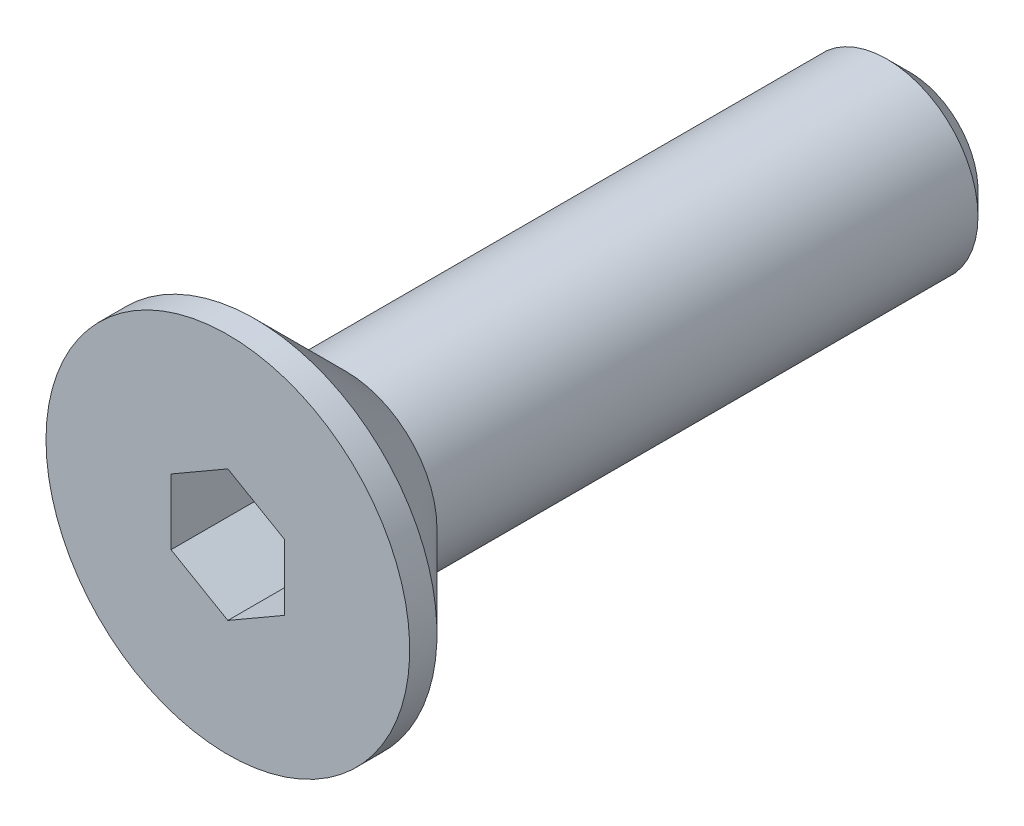
ISO-10303-21;
HEADER;
FILE_DESCRIPTION(('STEP AP214'),'2;1');
FILE_NAME('part.step','',(''),(''),'','','');
FILE_SCHEMA(('AUTOMOTIVE_DESIGN { 1 0 10303 214 1 1 1 1 }'));
ENDSEC;
DATA;
#1=APPLICATION_CONTEXT('core data for automotive mechanical design processes');
#2=APPLICATION_PROTOCOL_DEFINITION('international standard','automotive_design',2000,#1);
#3=PRODUCT_CONTEXT('',#1,'mechanical');
#4=PRODUCT('Part','Part','',(#3));
#5=PRODUCT_RELATED_PRODUCT_CATEGORY('part','',(#4));
#6=PRODUCT_DEFINITION_FORMATION('','',#4);
#7=PRODUCT_DEFINITION_CONTEXT('part definition',#1,'design');
#8=PRODUCT_DEFINITION('design','',#6,#7);
#9=PRODUCT_DEFINITION_SHAPE('','',#8);
#10=(LENGTH_UNIT() NAMED_UNIT(*) SI_UNIT(.MILLI.,.METRE.));
#11=(NAMED_UNIT(*) PLANE_ANGLE_UNIT() SI_UNIT($,.RADIAN.));
#12=(NAMED_UNIT(*) SI_UNIT($,.STERADIAN.) SOLID_ANGLE_UNIT());
#13=UNCERTAINTY_MEASURE_WITH_UNIT(LENGTH_MEASURE(1.E-05),#10,'distance_accuracy_value','');
#14=(GEOMETRIC_REPRESENTATION_CONTEXT(3) GLOBAL_UNCERTAINTY_ASSIGNED_CONTEXT((#13)) GLOBAL_UNIT_ASSIGNED_CONTEXT((#10,
#11,#12)) REPRESENTATION_CONTEXT('',''));
#15=CARTESIAN_POINT('',(0.,0.,0.));
#16=DIRECTION('',(0.,0.,1.));
#17=DIRECTION('',(1.,0.,0.));
#18=AXIS2_PLACEMENT_3D('',#15,#16,#17);
#19=CARTESIAN_POINT('',(0.,0.,7.5));
#20=DIRECTION('',(0.,0.,1.));
#21=DIRECTION('',(1.,0.,0.));
#22=AXIS2_PLACEMENT_3D('',#19,#20,#21);
#23=PLANE('',#22);
#24=DIRECTION('',(-0.866025403784439,0.5,0.));
#25=VECTOR('',#24,1.);
#26=CARTESIAN_POINT('',(1.25,0.721687836487034,7.5));
#27=LINE('',#26,#25);
#28=CARTESIAN_POINT('',(1.25,0.721687836487034,7.5));
#29=VERTEX_POINT('',#28);
#30=CARTESIAN_POINT('',(0.,1.44337567297407,7.5));
#31=VERTEX_POINT('',#30);
#32=EDGE_CURVE('E53',#29,#31,#27,.T.);
#33=ORIENTED_EDGE('',*,*,#32,.F.);
#34=DIRECTION('',(0.,1.,0.));
#35=VECTOR('',#34,1.);
#36=CARTESIAN_POINT('',(1.25,-0.721687836487031,7.5));
#37=LINE('',#36,#35);
#38=CARTESIAN_POINT('',(1.25,-0.721687836487031,7.5));
#39=VERTEX_POINT('',#38);
#40=EDGE_CURVE('E136',#39,#29,#37,.T.);
#41=ORIENTED_EDGE('',*,*,#40,.F.);
#42=DIRECTION('',(0.866025403784439,0.5,0.));
#43=VECTOR('',#42,1.);
#44=CARTESIAN_POINT('',(0.,-1.44337567297406,7.5));
#45=LINE('',#44,#43);
#46=CARTESIAN_POINT('',(0.,-1.44337567297406,7.5));
#47=VERTEX_POINT('',#46);
#48=EDGE_CURVE('E134',#47,#39,#45,.T.);
#49=ORIENTED_EDGE('',*,*,#48,.F.);
#50=DIRECTION('',(0.866025403784439,-0.5,0.));
#51=VECTOR('',#50,1.);
#52=CARTESIAN_POINT('',(-1.25,-0.721687836487031,7.5));
#53=LINE('',#52,#51);
#54=CARTESIAN_POINT('',(-1.25,-0.721687836487031,7.5));
#55=VERTEX_POINT('',#54);
#56=EDGE_CURVE('E101',#55,#47,#53,.T.);
#57=ORIENTED_EDGE('',*,*,#56,.F.);
#58=DIRECTION('',(0.,-1.,0.));
#59=VECTOR('',#58,1.);
#60=CARTESIAN_POINT('',(-1.25,0.721687836487034,7.5));
#61=LINE('',#60,#59);
#62=CARTESIAN_POINT('',(-1.25,0.721687836487034,7.5));
#63=VERTEX_POINT('',#62);
#64=EDGE_CURVE('E130',#63,#55,#61,.T.);
#65=ORIENTED_EDGE('',*,*,#64,.F.);
#66=DIRECTION('',(-0.866025403784439,-0.5,0.));
#67=VECTOR('',#66,1.);
#68=CARTESIAN_POINT('',(0.,1.44337567297407,7.5));
#69=LINE('',#68,#67);
#70=EDGE_CURVE('E127',#31,#63,#69,.T.);
#71=ORIENTED_EDGE('',*,*,#70,.F.);
#72=EDGE_LOOP('',(#33,#41,#49,#57,#65,#71));
#73=FACE_BOUND('',#72,.T.);
#74=CARTESIAN_POINT('',(0.,0.,7.5));
#75=DIRECTION('',(0.,0.,-1.));
#76=DIRECTION('',(-1.,0.,0.));
#77=AXIS2_PLACEMENT_3D('',#74,#75,#76);
#78=CIRCLE('',#77,4.);
#79=CARTESIAN_POINT('',(-4.,0.,7.5));
#80=VERTEX_POINT('',#79);
#81=EDGE_CURVE('E151',#80,#80,#78,.T.);
#82=ORIENTED_EDGE('',*,*,#81,.F.);
#83=EDGE_LOOP('',(#82));
#84=FACE_BOUND('',#83,.T.);
#85=ADVANCED_FACE('F37',(#73,#84),#23,.T.);
#86=CARTESIAN_POINT('',(0.,0.,-7.5));
#87=DIRECTION('',(0.,0.,-1.));
#88=DIRECTION('',(-1.,0.,0.));
#89=AXIS2_PLACEMENT_3D('',#86,#87,#88);
#90=CYLINDRICAL_SURFACE('',#89,4.);
#91=ORIENTED_EDGE('',*,*,#81,.T.);
#92=EDGE_LOOP('',(#91));
#93=FACE_BOUND('',#92,.T.);
#94=CARTESIAN_POINT('',(0.,0.,6.89999999999999));
#95=DIRECTION('',(0.,0.,-1.));
#96=DIRECTION('',(-1.,0.,0.));
#97=AXIS2_PLACEMENT_3D('',#94,#95,#96);
#98=CIRCLE('',#97,4.);
#99=CARTESIAN_POINT('',(-4.,0.,6.89999999999999));
#100=VERTEX_POINT('',#99);
#101=EDGE_CURVE('E148',#100,#100,#98,.T.);
#102=ORIENTED_EDGE('',*,*,#101,.F.);
#103=EDGE_LOOP('',(#102));
#104=FACE_BOUND('',#103,.T.);
#105=ADVANCED_FACE('F171',(#93,#104),#90,.T.);
#106=CARTESIAN_POINT('',(0.,0.,4.9));
#107=DIRECTION('',(0.,0.,1.));
#108=DIRECTION('',(1.,0.,0.));
#109=AXIS2_PLACEMENT_3D('',#106,#107,#108);
#110=CONICAL_SURFACE('',#109,2.,0.78539816339745);
#111=ORIENTED_EDGE('',*,*,#101,.T.);
#112=EDGE_LOOP('',(#111));
#113=FACE_BOUND('',#112,.T.);
#114=CARTESIAN_POINT('',(0.,0.,4.9));
#115=DIRECTION('',(0.,0.,-1.));
#116=DIRECTION('',(-1.,0.,0.));
#117=AXIS2_PLACEMENT_3D('',#114,#115,#116);
#118=CIRCLE('',#117,2.);
#119=CARTESIAN_POINT('',(-2.,0.,4.9));
#120=VERTEX_POINT('',#119);
#121=EDGE_CURVE('E140',#120,#120,#118,.T.);
#122=ORIENTED_EDGE('',*,*,#121,.F.);
#123=EDGE_LOOP('',(#122));
#124=FACE_BOUND('',#123,.T.);
#125=ADVANCED_FACE('F176',(#113,#124),#110,.T.);
#126=CARTESIAN_POINT('',(0.,0.,-7.5));
#127=DIRECTION('',(0.,0.,-1.));
#128=DIRECTION('',(-1.,0.,0.));
#129=AXIS2_PLACEMENT_3D('',#126,#127,#128);
#130=CYLINDRICAL_SURFACE('',#129,2.);
#131=CARTESIAN_POINT('',(0.,0.,-7.));
#132=DIRECTION('',(0.,0.,-1.));
#133=DIRECTION('',(-1.,0.,0.));
#134=AXIS2_PLACEMENT_3D('',#131,#132,#133);
#135=CIRCLE('',#134,2.);
#136=CARTESIAN_POINT('',(-2.,0.,-7.));
#137=VERTEX_POINT('',#136);
#138=EDGE_CURVE('E11',#137,#137,#135,.F.);
#139=ORIENTED_EDGE('',*,*,#138,.T.);
#140=EDGE_LOOP('',(#139));
#141=FACE_BOUND('',#140,.T.);
#142=ORIENTED_EDGE('',*,*,#121,.T.);
#143=EDGE_LOOP('',(#142));
#144=FACE_BOUND('',#143,.T.);
#145=ADVANCED_FACE('F167',(#141,#144),#130,.T.);
#146=CARTESIAN_POINT('',(0.,2.,-7.5));
#147=DIRECTION('',(0.,0.,-1.));
#148=DIRECTION('',(-1.,0.,0.));
#149=AXIS2_PLACEMENT_3D('',#146,#147,#148);
#150=PLANE('',#149);
#151=CARTESIAN_POINT('',(0.,0.,-7.5));
#152=DIRECTION('',(0.,0.,-1.));
#153=DIRECTION('',(-1.,0.,0.));
#154=AXIS2_PLACEMENT_3D('',#151,#152,#153);
#155=CIRCLE('',#154,1.5);
#156=CARTESIAN_POINT('',(-1.5,0.,-7.5));
#157=VERTEX_POINT('',#156);
#158=EDGE_CURVE('E46',#157,#157,#155,.T.);
#159=ORIENTED_EDGE('',*,*,#158,.T.);
#160=EDGE_LOOP('',(#159));
#161=FACE_BOUND('',#160,.T.);
#162=ADVANCED_FACE('F156',(#161),#150,.T.);
#163=CARTESIAN_POINT('',(0.,0.,-7.5));
#164=DIRECTION('',(0.,0.,1.));
#165=DIRECTION('',(1.,0.,0.));
#166=AXIS2_PLACEMENT_3D('',#163,#164,#165);
#167=CONICAL_SURFACE('',#166,1.5,0.785398163397447);
#168=ORIENTED_EDGE('',*,*,#138,.F.);
#169=EDGE_LOOP('',(#168));
#170=FACE_BOUND('',#169,.T.);
#171=ORIENTED_EDGE('',*,*,#158,.F.);
#172=EDGE_LOOP('',(#171));
#173=FACE_BOUND('',#172,.T.);
#174=ADVANCED_FACE('F40',(#170,#173),#167,.T.);
#175=CARTESIAN_POINT('',(1.25,0.721687836487034,5.));
#176=DIRECTION('',(0.5,0.866025403784439,0.));
#177=DIRECTION('',(-0.866025403784439,0.5,0.));
#178=AXIS2_PLACEMENT_3D('',#175,#176,#177);
#179=PLANE('',#178);
#180=ORIENTED_EDGE('',*,*,#32,.T.);
#181=DIRECTION('',(0.,0.,1.));
#182=VECTOR('',#181,1.);
#183=CARTESIAN_POINT('',(0.,1.44337567297407,5.));
#184=LINE('',#183,#182);
#185=CARTESIAN_POINT('',(0.,1.44337567297407,5.));
#186=VERTEX_POINT('',#185);
#187=EDGE_CURVE('E83',#186,#31,#184,.T.);
#188=ORIENTED_EDGE('',*,*,#187,.F.);
#189=DIRECTION('',(-0.866025403784439,0.5,0.));
#190=VECTOR('',#189,1.);
#191=CARTESIAN_POINT('',(1.25,0.721687836487034,5.));
#192=LINE('',#191,#190);
#193=CARTESIAN_POINT('',(1.25,0.721687836487034,5.));
#194=VERTEX_POINT('',#193);
#195=EDGE_CURVE('E138',#194,#186,#192,.T.);
#196=ORIENTED_EDGE('',*,*,#195,.F.);
#197=DIRECTION('',(0.,0.,1.));
#198=VECTOR('',#197,1.);
#199=CARTESIAN_POINT('',(1.25,0.721687836487034,5.));
#200=LINE('',#199,#198);
#201=EDGE_CURVE('E61',#194,#29,#200,.T.);
#202=ORIENTED_EDGE('',*,*,#201,.T.);
#203=EDGE_LOOP('',(#180,#188,#196,#202));
#204=FACE_BOUND('',#203,.T.);
#205=ADVANCED_FACE('F159',(#204),#179,.F.);
#206=CARTESIAN_POINT('',(1.25,-0.721687836487031,5.));
#207=DIRECTION('',(1.,0.,0.));
#208=DIRECTION('',(0.,1.,0.));
#209=AXIS2_PLACEMENT_3D('',#206,#207,#208);
#210=PLANE('',#209);
#211=ORIENTED_EDGE('',*,*,#40,.T.);
#212=ORIENTED_EDGE('',*,*,#201,.F.);
#213=DIRECTION('',(0.,1.,0.));
#214=VECTOR('',#213,1.);
#215=CARTESIAN_POINT('',(1.25,-0.721687836487031,5.));
#216=LINE('',#215,#214);
#217=CARTESIAN_POINT('',(1.25,-0.721687836487031,5.));
#218=VERTEX_POINT('',#217);
#219=EDGE_CURVE('E113',#218,#194,#216,.T.);
#220=ORIENTED_EDGE('',*,*,#219,.F.);
#221=DIRECTION('',(0.,0.,1.));
#222=VECTOR('',#221,1.);
#223=CARTESIAN_POINT('',(1.25,-0.721687836487031,5.));
#224=LINE('',#223,#222);
#225=EDGE_CURVE('E105',#218,#39,#224,.T.);
#226=ORIENTED_EDGE('',*,*,#225,.T.);
#227=EDGE_LOOP('',(#211,#212,#220,#226));
#228=FACE_BOUND('',#227,.T.);
#229=ADVANCED_FACE('F165',(#228),#210,.F.);
#230=CARTESIAN_POINT('',(0.,-1.44337567297406,5.));
#231=DIRECTION('',(0.5,-0.866025403784439,0.));
#232=DIRECTION('',(0.866025403784439,0.5,0.));
#233=AXIS2_PLACEMENT_3D('',#230,#231,#232);
#234=PLANE('',#233);
#235=ORIENTED_EDGE('',*,*,#48,.T.);
#236=ORIENTED_EDGE('',*,*,#225,.F.);
#237=DIRECTION('',(0.866025403784439,0.5,0.));
#238=VECTOR('',#237,1.);
#239=CARTESIAN_POINT('',(0.,-1.44337567297406,5.));
#240=LINE('',#239,#238);
#241=CARTESIAN_POINT('',(0.,-1.44337567297406,5.));
#242=VERTEX_POINT('',#241);
#243=EDGE_CURVE('E109',#242,#218,#240,.T.);
#244=ORIENTED_EDGE('',*,*,#243,.F.);
#245=DIRECTION('',(0.,0.,1.));
#246=VECTOR('',#245,1.);
#247=CARTESIAN_POINT('',(0.,-1.44337567297406,5.));
#248=LINE('',#247,#246);
#249=EDGE_CURVE('E94',#242,#47,#248,.T.);
#250=ORIENTED_EDGE('',*,*,#249,.T.);
#251=EDGE_LOOP('',(#235,#236,#244,#250));
#252=FACE_BOUND('',#251,.T.);
#253=ADVANCED_FACE('F110',(#252),#234,.F.);
#254=CARTESIAN_POINT('',(-1.25,-0.721687836487031,5.));
#255=DIRECTION('',(-0.5,-0.866025403784438,0.));
#256=DIRECTION('',(0.866025403784439,-0.5,0.));
#257=AXIS2_PLACEMENT_3D('',#254,#255,#256);
#258=PLANE('',#257);
#259=ORIENTED_EDGE('',*,*,#56,.T.);
#260=ORIENTED_EDGE('',*,*,#249,.F.);
#261=DIRECTION('',(0.866025403784439,-0.5,0.));
#262=VECTOR('',#261,1.);
#263=CARTESIAN_POINT('',(-1.25,-0.721687836487031,5.));
#264=LINE('',#263,#262);
#265=CARTESIAN_POINT('',(-1.25,-0.721687836487031,5.));
#266=VERTEX_POINT('',#265);
#267=EDGE_CURVE('E98',#266,#242,#264,.T.);
#268=ORIENTED_EDGE('',*,*,#267,.F.);
#269=DIRECTION('',(0.,0.,1.));
#270=VECTOR('',#269,1.);
#271=CARTESIAN_POINT('',(-1.25,-0.721687836487031,5.));
#272=LINE('',#271,#270);
#273=EDGE_CURVE('E106',#266,#55,#272,.T.);
#274=ORIENTED_EDGE('',*,*,#273,.T.);
#275=EDGE_LOOP('',(#259,#260,#268,#274));
#276=FACE_BOUND('',#275,.T.);
#277=ADVANCED_FACE('F96',(#276),#258,.F.);
#278=CARTESIAN_POINT('',(-1.25,0.721687836487034,5.));
#279=DIRECTION('',(-1.,0.,0.));
#280=DIRECTION('',(0.,0.,1.));
#281=AXIS2_PLACEMENT_3D('',#278,#279,#280);
#282=PLANE('',#281);
#283=ORIENTED_EDGE('',*,*,#64,.T.);
#284=ORIENTED_EDGE('',*,*,#273,.F.);
#285=DIRECTION('',(0.,-1.,0.));
#286=VECTOR('',#285,1.);
#287=CARTESIAN_POINT('',(-1.25,0.721687836487034,5.));
#288=LINE('',#287,#286);
#289=CARTESIAN_POINT('',(-1.25,0.721687836487034,5.));
#290=VERTEX_POINT('',#289);
#291=EDGE_CURVE('E119',#290,#266,#288,.T.);
#292=ORIENTED_EDGE('',*,*,#291,.F.);
#293=DIRECTION('',(0.,0.,1.));
#294=VECTOR('',#293,1.);
#295=CARTESIAN_POINT('',(-1.25,0.721687836487034,5.));
#296=LINE('',#295,#294);
#297=EDGE_CURVE('E143',#290,#63,#296,.T.);
#298=ORIENTED_EDGE('',*,*,#297,.T.);
#299=EDGE_LOOP('',(#283,#284,#292,#298));
#300=FACE_BOUND('',#299,.T.);
#301=ADVANCED_FACE('F190',(#300),#282,.F.);
#302=CARTESIAN_POINT('',(0.,1.44337567297407,5.));
#303=DIRECTION('',(-0.5,0.866025403784439,0.));
#304=DIRECTION('',(-0.866025403784439,-0.5,0.));
#305=AXIS2_PLACEMENT_3D('',#302,#303,#304);
#306=PLANE('',#305);
#307=ORIENTED_EDGE('',*,*,#70,.T.);
#308=ORIENTED_EDGE('',*,*,#297,.F.);
#309=DIRECTION('',(-0.866025403784439,-0.5,0.));
#310=VECTOR('',#309,1.);
#311=CARTESIAN_POINT('',(0.,1.44337567297407,5.));
#312=LINE('',#311,#310);
#313=EDGE_CURVE('E121',#186,#290,#312,.T.);
#314=ORIENTED_EDGE('',*,*,#313,.F.);
#315=ORIENTED_EDGE('',*,*,#187,.T.);
#316=EDGE_LOOP('',(#307,#308,#314,#315));
#317=FACE_BOUND('',#316,.T.);
#318=ADVANCED_FACE('F187',(#317),#306,.F.);
#319=CARTESIAN_POINT('',(0.,0.,5.));
#320=DIRECTION('',(0.,0.,1.));
#321=DIRECTION('',(1.,0.,0.));
#322=AXIS2_PLACEMENT_3D('',#319,#320,#321);
#323=PLANE('',#322);
#324=ORIENTED_EDGE('',*,*,#195,.T.);
#325=ORIENTED_EDGE('',*,*,#313,.T.);
#326=ORIENTED_EDGE('',*,*,#291,.T.);
#327=ORIENTED_EDGE('',*,*,#267,.T.);
#328=ORIENTED_EDGE('',*,*,#243,.T.);
#329=ORIENTED_EDGE('',*,*,#219,.T.);
#330=EDGE_LOOP('',(#324,#325,#326,#327,#328,#329));
#331=FACE_BOUND('',#330,.T.);
#332=ADVANCED_FACE('F116',(#331),#323,.T.);
#333=CLOSED_SHELL('',(#85,#105,#125,#145,#162,#174,#205,#229,#253,#277,#301,#318,#332));
#334=MANIFOLD_SOLID_BREP('B2',#333);
#335=ADVANCED_BREP_SHAPE_REPRESENTATION('',(#18,#334),#14);
#336=SHAPE_DEFINITION_REPRESENTATION(#9,#335);
ENDSEC;
END-ISO-10303-21;
